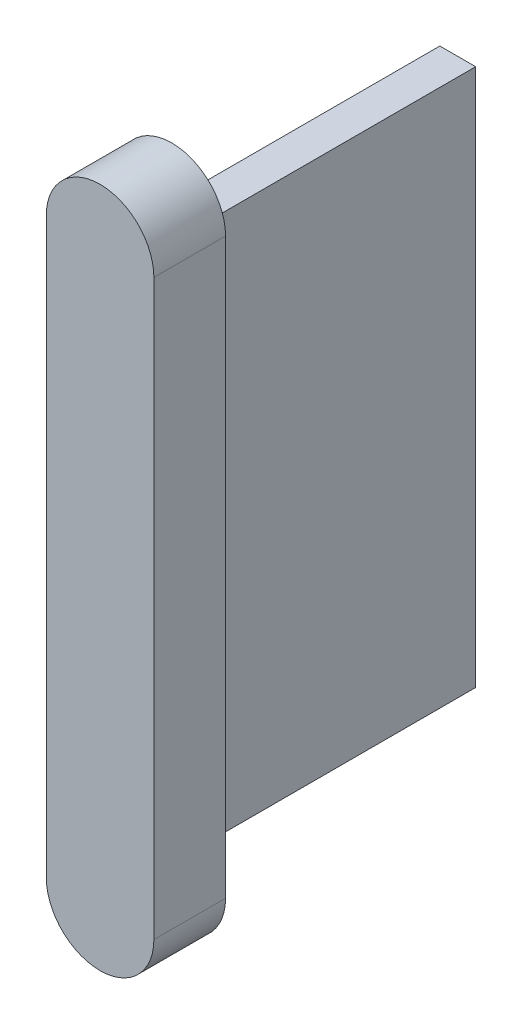
ISO-10303-21;
HEADER;
FILE_DESCRIPTION(('STEP AP214'),'2;1');
FILE_NAME('part.step','',(''),(''),'','','');
FILE_SCHEMA(('AUTOMOTIVE_DESIGN { 1 0 10303 214 1 1 1 1 }'));
ENDSEC;
DATA;
#1=APPLICATION_CONTEXT('core data for automotive mechanical design processes');
#2=APPLICATION_PROTOCOL_DEFINITION('international standard','automotive_design',2000,#1);
#3=PRODUCT_CONTEXT('',#1,'mechanical');
#4=PRODUCT('Part','Part','',(#3));
#5=PRODUCT_RELATED_PRODUCT_CATEGORY('part','',(#4));
#6=PRODUCT_DEFINITION_FORMATION('','',#4);
#7=PRODUCT_DEFINITION_CONTEXT('part definition',#1,'design');
#8=PRODUCT_DEFINITION('design','',#6,#7);
#9=PRODUCT_DEFINITION_SHAPE('','',#8);
#10=(LENGTH_UNIT() NAMED_UNIT(*) SI_UNIT(.MILLI.,.METRE.));
#11=(NAMED_UNIT(*) PLANE_ANGLE_UNIT() SI_UNIT($,.RADIAN.));
#12=(NAMED_UNIT(*) SI_UNIT($,.STERADIAN.) SOLID_ANGLE_UNIT());
#13=UNCERTAINTY_MEASURE_WITH_UNIT(LENGTH_MEASURE(1.E-05),#10,'distance_accuracy_value','');
#14=(GEOMETRIC_REPRESENTATION_CONTEXT(3) GLOBAL_UNCERTAINTY_ASSIGNED_CONTEXT((#13)) GLOBAL_UNIT_ASSIGNED_CONTEXT((#10,
#11,#12)) REPRESENTATION_CONTEXT('',''));
#15=CARTESIAN_POINT('',(0.,0.,0.));
#16=DIRECTION('',(0.,0.,1.));
#17=DIRECTION('',(1.,0.,0.));
#18=AXIS2_PLACEMENT_3D('',#15,#16,#17);
#19=CARTESIAN_POINT('',(0.,-13.6733494549959,0.));
#20=DIRECTION('',(0.,0.,1.));
#21=DIRECTION('',(1.,0.,0.));
#22=AXIS2_PLACEMENT_3D('',#19,#20,#21);
#23=PLANE('',#22);
#24=CARTESIAN_POINT('',(0.,-13.6733494549959,0.));
#25=DIRECTION('',(0.,0.,1.));
#26=DIRECTION('',(1.,0.,0.));
#27=AXIS2_PLACEMENT_3D('',#24,#25,#26);
#28=CIRCLE('',#27,1.5);
#29=CARTESIAN_POINT('',(1.49999999999998,-13.6733494549959,0.));
#30=VERTEX_POINT('',#29);
#31=CARTESIAN_POINT('',(-1.50000000000002,-13.6733494549959,0.));
#32=VERTEX_POINT('',#31);
#33=EDGE_CURVE('E123',#30,#32,#28,.T.);
#34=ORIENTED_EDGE('',*,*,#33,.F.);
#35=DIRECTION('',(0.,-1.,0.));
#36=VECTOR('',#35,1.);
#37=CARTESIAN_POINT('',(1.49999999999998,-13.6733494549959,0.));
#38=LINE('',#37,#36);
#39=CARTESIAN_POINT('',(1.49999999999999,-29.6733494549959,0.));
#40=VERTEX_POINT('',#39);
#41=EDGE_CURVE('E136',#30,#40,#38,.T.);
#42=ORIENTED_EDGE('',*,*,#41,.T.);
#43=CARTESIAN_POINT('',(0.,-29.6733494549959,0.));
#44=DIRECTION('',(0.,0.,1.));
#45=DIRECTION('',(1.,0.,0.));
#46=AXIS2_PLACEMENT_3D('',#43,#44,#45);
#47=CIRCLE('',#46,1.5);
#48=CARTESIAN_POINT('',(-1.50000000000002,-29.6733494549959,0.));
#49=VERTEX_POINT('',#48);
#50=EDGE_CURVE('E145',#49,#40,#47,.T.);
#51=ORIENTED_EDGE('',*,*,#50,.F.);
#52=DIRECTION('',(0.,-1.,0.));
#53=VECTOR('',#52,1.);
#54=CARTESIAN_POINT('',(-1.50000000000002,-13.6733494549959,0.));
#55=LINE('',#54,#53);
#56=EDGE_CURVE('E126',#32,#49,#55,.T.);
#57=ORIENTED_EDGE('',*,*,#56,.F.);
#58=EDGE_LOOP('',(#34,#42,#51,#57));
#59=FACE_BOUND('',#58,.T.);
#60=DIRECTION('',(0.,-1.,0.));
#61=VECTOR('',#60,1.);
#62=CARTESIAN_POINT('',(0.477727059152445,-14.0929412337031,0.));
#63=LINE('',#62,#61);
#64=CARTESIAN_POINT('',(0.477727059152445,-14.0929412337031,0.));
#65=VERTEX_POINT('',#64);
#66=CARTESIAN_POINT('',(0.477727059152443,-29.0929412337031,0.));
#67=VERTEX_POINT('',#66);
#68=EDGE_CURVE('E53',#65,#67,#63,.T.);
#69=ORIENTED_EDGE('',*,*,#68,.F.);
#70=DIRECTION('',(1.,0.,0.));
#71=VECTOR('',#70,1.);
#72=CARTESIAN_POINT('',(0.477727059152445,-14.0929412337031,0.));
#73=LINE('',#72,#71);
#74=CARTESIAN_POINT('',(-0.522272940847555,-14.0929412337031,0.));
#75=VERTEX_POINT('',#74);
#76=EDGE_CURVE('E57',#75,#65,#73,.T.);
#77=ORIENTED_EDGE('',*,*,#76,.F.);
#78=DIRECTION('',(0.,1.,0.));
#79=VECTOR('',#78,1.);
#80=CARTESIAN_POINT('',(-0.522272940847555,-14.0929412337031,0.));
#81=LINE('',#80,#79);
#82=CARTESIAN_POINT('',(-0.522272940847557,-29.0929412337031,0.));
#83=VERTEX_POINT('',#82);
#84=EDGE_CURVE('E287',#83,#75,#81,.T.);
#85=ORIENTED_EDGE('',*,*,#84,.F.);
#86=DIRECTION('',(-1.,0.,0.));
#87=VECTOR('',#86,1.);
#88=CARTESIAN_POINT('',(0.477727059152443,-29.0929412337031,0.));
#89=LINE('',#88,#87);
#90=EDGE_CURVE('E293',#67,#83,#89,.T.);
#91=ORIENTED_EDGE('',*,*,#90,.F.);
#92=EDGE_LOOP('',(#69,#77,#85,#91));
#93=FACE_BOUND('',#92,.T.);
#94=ADVANCED_FACE('F38',(#59,#93),#23,.F.);
#95=CARTESIAN_POINT('',(0.,-13.6733494549959,2.));
#96=DIRECTION('',(0.,0.,-1.));
#97=DIRECTION('',(-1.,0.,0.));
#98=AXIS2_PLACEMENT_3D('',#95,#96,#97);
#99=CYLINDRICAL_SURFACE('',#98,1.5);
#100=ORIENTED_EDGE('',*,*,#33,.T.);
#101=DIRECTION('',(0.,0.,-1.));
#102=VECTOR('',#101,1.);
#103=CARTESIAN_POINT('',(-1.50000000000002,-13.6733494549959,2.));
#104=LINE('',#103,#102);
#105=CARTESIAN_POINT('',(-1.50000000000002,-13.6733494549959,2.));
#106=VERTEX_POINT('',#105);
#107=EDGE_CURVE('E11',#106,#32,#104,.T.);
#108=ORIENTED_EDGE('',*,*,#107,.F.);
#109=CARTESIAN_POINT('',(0.,-13.6733494549959,2.));
#110=DIRECTION('',(0.,0.,1.));
#111=DIRECTION('',(1.,0.,0.));
#112=AXIS2_PLACEMENT_3D('',#109,#110,#111);
#113=CIRCLE('',#112,1.5);
#114=CARTESIAN_POINT('',(1.49999999999998,-13.6733494549959,2.));
#115=VERTEX_POINT('',#114);
#116=EDGE_CURVE('E132',#115,#106,#113,.T.);
#117=ORIENTED_EDGE('',*,*,#116,.F.);
#118=DIRECTION('',(0.,0.,-1.));
#119=VECTOR('',#118,1.);
#120=CARTESIAN_POINT('',(1.49999999999998,-13.6733494549959,2.));
#121=LINE('',#120,#119);
#122=EDGE_CURVE('E142',#115,#30,#121,.T.);
#123=ORIENTED_EDGE('',*,*,#122,.T.);
#124=EDGE_LOOP('',(#100,#108,#117,#123));
#125=FACE_BOUND('',#124,.T.);
#126=ADVANCED_FACE('F40',(#125),#99,.T.);
#127=CARTESIAN_POINT('',(-1.50000000000002,-13.6733494549959,2.));
#128=DIRECTION('',(1.,0.,0.));
#129=DIRECTION('',(0.,1.,0.));
#130=AXIS2_PLACEMENT_3D('',#127,#128,#129);
#131=PLANE('',#130);
#132=ORIENTED_EDGE('',*,*,#56,.T.);
#133=DIRECTION('',(0.,0.,-1.));
#134=VECTOR('',#133,1.);
#135=CARTESIAN_POINT('',(-1.50000000000002,-29.6733494549959,2.));
#136=LINE('',#135,#134);
#137=CARTESIAN_POINT('',(-1.50000000000002,-29.6733494549959,2.));
#138=VERTEX_POINT('',#137);
#139=EDGE_CURVE('E46',#138,#49,#136,.T.);
#140=ORIENTED_EDGE('',*,*,#139,.F.);
#141=DIRECTION('',(0.,-1.,0.));
#142=VECTOR('',#141,1.);
#143=CARTESIAN_POINT('',(-1.50000000000002,-13.6733494549959,2.));
#144=LINE('',#143,#142);
#145=EDGE_CURVE('E135',#106,#138,#144,.T.);
#146=ORIENTED_EDGE('',*,*,#145,.F.);
#147=ORIENTED_EDGE('',*,*,#107,.T.);
#148=EDGE_LOOP('',(#132,#140,#146,#147));
#149=FACE_BOUND('',#148,.T.);
#150=ADVANCED_FACE('F170',(#149),#131,.F.);
#151=CARTESIAN_POINT('',(0.,-29.6733494549959,2.));
#152=DIRECTION('',(0.,0.,-1.));
#153=DIRECTION('',(-1.,0.,0.));
#154=AXIS2_PLACEMENT_3D('',#151,#152,#153);
#155=CYLINDRICAL_SURFACE('',#154,1.5);
#156=ORIENTED_EDGE('',*,*,#50,.T.);
#157=DIRECTION('',(0.,0.,-1.));
#158=VECTOR('',#157,1.);
#159=CARTESIAN_POINT('',(1.49999999999999,-29.6733494549959,2.));
#160=LINE('',#159,#158);
#161=CARTESIAN_POINT('',(1.49999999999999,-29.6733494549959,2.));
#162=VERTEX_POINT('',#161);
#163=EDGE_CURVE('E151',#162,#40,#160,.T.);
#164=ORIENTED_EDGE('',*,*,#163,.F.);
#165=CARTESIAN_POINT('',(0.,-29.6733494549959,2.));
#166=DIRECTION('',(0.,0.,1.));
#167=DIRECTION('',(1.,0.,0.));
#168=AXIS2_PLACEMENT_3D('',#165,#166,#167);
#169=CIRCLE('',#168,1.5);
#170=EDGE_CURVE('E138',#138,#162,#169,.T.);
#171=ORIENTED_EDGE('',*,*,#170,.F.);
#172=ORIENTED_EDGE('',*,*,#139,.T.);
#173=EDGE_LOOP('',(#156,#164,#171,#172));
#174=FACE_BOUND('',#173,.T.);
#175=ADVANCED_FACE('F157',(#174),#155,.T.);
#176=CARTESIAN_POINT('',(1.49999999999998,-13.6733494549959,2.));
#177=DIRECTION('',(1.,0.,0.));
#178=DIRECTION('',(0.,1.,0.));
#179=AXIS2_PLACEMENT_3D('',#176,#177,#178);
#180=PLANE('',#179);
#181=ORIENTED_EDGE('',*,*,#41,.F.);
#182=ORIENTED_EDGE('',*,*,#122,.F.);
#183=DIRECTION('',(0.,-1.,0.));
#184=VECTOR('',#183,1.);
#185=CARTESIAN_POINT('',(1.49999999999998,-13.6733494549959,2.));
#186=LINE('',#185,#184);
#187=EDGE_CURVE('E140',#115,#162,#186,.T.);
#188=ORIENTED_EDGE('',*,*,#187,.T.);
#189=ORIENTED_EDGE('',*,*,#163,.T.);
#190=EDGE_LOOP('',(#181,#182,#188,#189));
#191=FACE_BOUND('',#190,.T.);
#192=ADVANCED_FACE('F164',(#191),#180,.T.);
#193=CARTESIAN_POINT('',(0.,-13.6733494549959,2.));
#194=DIRECTION('',(0.,0.,1.));
#195=DIRECTION('',(1.,0.,0.));
#196=AXIS2_PLACEMENT_3D('',#193,#194,#195);
#197=PLANE('',#196);
#198=ORIENTED_EDGE('',*,*,#116,.T.);
#199=ORIENTED_EDGE('',*,*,#145,.T.);
#200=ORIENTED_EDGE('',*,*,#170,.T.);
#201=ORIENTED_EDGE('',*,*,#187,.F.);
#202=EDGE_LOOP('',(#198,#199,#200,#201));
#203=FACE_BOUND('',#202,.T.);
#204=ADVANCED_FACE('F168',(#203),#197,.T.);
#205=CARTESIAN_POINT('',(0.477727059152445,-14.0929412337031,-8.));
#206=DIRECTION('',(-1.,0.,0.));
#207=DIRECTION('',(0.,-1.,0.));
#208=AXIS2_PLACEMENT_3D('',#205,#206,#207);
#209=PLANE('',#208);
#210=ORIENTED_EDGE('',*,*,#68,.T.);
#211=DIRECTION('',(0.,0.,1.));
#212=VECTOR('',#211,1.);
#213=CARTESIAN_POINT('',(0.477727059152443,-29.0929412337031,-8.));
#214=LINE('',#213,#212);
#215=CARTESIAN_POINT('',(0.477727059152443,-29.0929412337031,-8.));
#216=VERTEX_POINT('',#215);
#217=EDGE_CURVE('E106',#216,#67,#214,.T.);
#218=ORIENTED_EDGE('',*,*,#217,.F.);
#219=DIRECTION('',(0.,-1.,0.));
#220=VECTOR('',#219,1.);
#221=CARTESIAN_POINT('',(0.477727059152445,-14.0929412337031,-8.));
#222=LINE('',#221,#220);
#223=CARTESIAN_POINT('',(0.477727059152445,-14.0929412337031,-8.));
#224=VERTEX_POINT('',#223);
#225=EDGE_CURVE('E112',#224,#216,#222,.T.);
#226=ORIENTED_EDGE('',*,*,#225,.F.);
#227=DIRECTION('',(0.,0.,1.));
#228=VECTOR('',#227,1.);
#229=CARTESIAN_POINT('',(0.477727059152445,-14.0929412337031,-8.));
#230=LINE('',#229,#228);
#231=EDGE_CURVE('E285',#224,#65,#230,.T.);
#232=ORIENTED_EDGE('',*,*,#231,.T.);
#233=EDGE_LOOP('',(#210,#218,#226,#232));
#234=FACE_BOUND('',#233,.T.);
#235=ADVANCED_FACE('F122',(#234),#209,.F.);
#236=CARTESIAN_POINT('',(0.477727059152443,-29.0929412337031,-8.));
#237=DIRECTION('',(0.,1.,0.));
#238=DIRECTION('',(0.,0.,1.));
#239=AXIS2_PLACEMENT_3D('',#236,#237,#238);
#240=PLANE('',#239);
#241=ORIENTED_EDGE('',*,*,#90,.T.);
#242=DIRECTION('',(0.,0.,1.));
#243=VECTOR('',#242,1.);
#244=CARTESIAN_POINT('',(-0.522272940847557,-29.0929412337031,-8.));
#245=LINE('',#244,#243);
#246=CARTESIAN_POINT('',(-0.522272940847557,-29.0929412337031,-8.));
#247=VERTEX_POINT('',#246);
#248=EDGE_CURVE('E108',#247,#83,#245,.T.);
#249=ORIENTED_EDGE('',*,*,#248,.F.);
#250=DIRECTION('',(-1.,0.,0.));
#251=VECTOR('',#250,1.);
#252=CARTESIAN_POINT('',(0.477727059152443,-29.0929412337031,-8.));
#253=LINE('',#252,#251);
#254=EDGE_CURVE('E101',#216,#247,#253,.T.);
#255=ORIENTED_EDGE('',*,*,#254,.F.);
#256=ORIENTED_EDGE('',*,*,#217,.T.);
#257=EDGE_LOOP('',(#241,#249,#255,#256));
#258=FACE_BOUND('',#257,.T.);
#259=ADVANCED_FACE('F104',(#258),#240,.F.);
#260=CARTESIAN_POINT('',(-0.522272940847555,-14.0929412337031,-8.));
#261=DIRECTION('',(1.,0.,0.));
#262=DIRECTION('',(0.,1.,0.));
#263=AXIS2_PLACEMENT_3D('',#260,#261,#262);
#264=PLANE('',#263);
#265=ORIENTED_EDGE('',*,*,#84,.T.);
#266=DIRECTION('',(0.,0.,1.));
#267=VECTOR('',#266,1.);
#268=CARTESIAN_POINT('',(-0.522272940847555,-14.0929412337031,-8.));
#269=LINE('',#268,#267);
#270=CARTESIAN_POINT('',(-0.522272940847555,-14.0929412337031,-8.));
#271=VERTEX_POINT('',#270);
#272=EDGE_CURVE('E128',#271,#75,#269,.T.);
#273=ORIENTED_EDGE('',*,*,#272,.F.);
#274=DIRECTION('',(0.,1.,0.));
#275=VECTOR('',#274,1.);
#276=CARTESIAN_POINT('',(-0.522272940847555,-14.0929412337031,-8.));
#277=LINE('',#276,#275);
#278=EDGE_CURVE('E111',#247,#271,#277,.T.);
#279=ORIENTED_EDGE('',*,*,#278,.F.);
#280=ORIENTED_EDGE('',*,*,#248,.T.);
#281=EDGE_LOOP('',(#265,#273,#279,#280));
#282=FACE_BOUND('',#281,.T.);
#283=ADVANCED_FACE('F210',(#282),#264,.F.);
#284=CARTESIAN_POINT('',(0.477727059152445,-14.0929412337031,-8.));
#285=DIRECTION('',(0.,-1.,0.));
#286=DIRECTION('',(0.,0.,-1.));
#287=AXIS2_PLACEMENT_3D('',#284,#285,#286);
#288=PLANE('',#287);
#289=ORIENTED_EDGE('',*,*,#76,.T.);
#290=ORIENTED_EDGE('',*,*,#231,.F.);
#291=DIRECTION('',(1.,0.,0.));
#292=VECTOR('',#291,1.);
#293=CARTESIAN_POINT('',(0.477727059152445,-14.0929412337031,-8.));
#294=LINE('',#293,#292);
#295=EDGE_CURVE('E117',#271,#224,#294,.T.);
#296=ORIENTED_EDGE('',*,*,#295,.F.);
#297=ORIENTED_EDGE('',*,*,#272,.T.);
#298=EDGE_LOOP('',(#289,#290,#296,#297));
#299=FACE_BOUND('',#298,.T.);
#300=ADVANCED_FACE('F217',(#299),#288,.F.);
#301=CARTESIAN_POINT('',(0.,0.,-8.));
#302=DIRECTION('',(0.,0.,-1.));
#303=DIRECTION('',(-1.,0.,0.));
#304=AXIS2_PLACEMENT_3D('',#301,#302,#303);
#305=PLANE('',#304);
#306=ORIENTED_EDGE('',*,*,#225,.T.);
#307=ORIENTED_EDGE('',*,*,#254,.T.);
#308=ORIENTED_EDGE('',*,*,#278,.T.);
#309=ORIENTED_EDGE('',*,*,#295,.T.);
#310=EDGE_LOOP('',(#306,#307,#308,#309));
#311=FACE_BOUND('',#310,.T.);
#312=ADVANCED_FACE('F115',(#311),#305,.T.);
#313=CLOSED_SHELL('',(#94,#126,#150,#175,#192,#204,#235,#259,#283,#300,#312));
#314=MANIFOLD_SOLID_BREP('B2',#313);
#315=ADVANCED_BREP_SHAPE_REPRESENTATION('',(#18,#314),#14);
#316=SHAPE_DEFINITION_REPRESENTATION(#9,#315);
ENDSEC;
END-ISO-10303-21;
